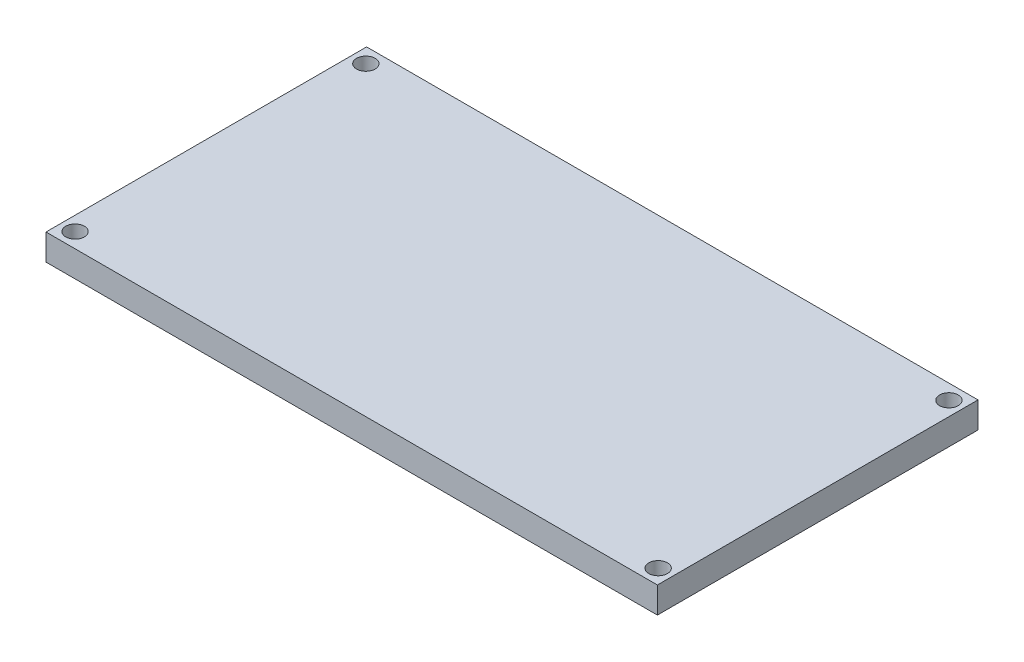
ISO-10303-21;
HEADER;
FILE_DESCRIPTION(('STEP AP214'),'2;1');
FILE_NAME('part.step','',(''),(''),'','','');
FILE_SCHEMA(('AUTOMOTIVE_DESIGN { 1 0 10303 214 1 1 1 1 }'));
ENDSEC;
DATA;
#1=APPLICATION_CONTEXT('core data for automotive mechanical design processes');
#2=APPLICATION_PROTOCOL_DEFINITION('international standard','automotive_design',2000,#1);
#3=PRODUCT_CONTEXT('',#1,'mechanical');
#4=PRODUCT('Part','Part','',(#3));
#5=PRODUCT_RELATED_PRODUCT_CATEGORY('part','',(#4));
#6=PRODUCT_DEFINITION_FORMATION('','',#4);
#7=PRODUCT_DEFINITION_CONTEXT('part definition',#1,'design');
#8=PRODUCT_DEFINITION('design','',#6,#7);
#9=PRODUCT_DEFINITION_SHAPE('','',#8);
#10=(LENGTH_UNIT() NAMED_UNIT(*) SI_UNIT(.MILLI.,.METRE.));
#11=(NAMED_UNIT(*) PLANE_ANGLE_UNIT() SI_UNIT($,.RADIAN.));
#12=(NAMED_UNIT(*) SI_UNIT($,.STERADIAN.) SOLID_ANGLE_UNIT());
#13=UNCERTAINTY_MEASURE_WITH_UNIT(LENGTH_MEASURE(1.E-05),#10,'distance_accuracy_value','');
#14=(GEOMETRIC_REPRESENTATION_CONTEXT(3) GLOBAL_UNCERTAINTY_ASSIGNED_CONTEXT((#13)) GLOBAL_UNIT_ASSIGNED_CONTEXT((#10,
#11,#12)) REPRESENTATION_CONTEXT('',''));
#15=CARTESIAN_POINT('',(0.,0.,0.));
#16=DIRECTION('',(0.,0.,1.));
#17=DIRECTION('',(1.,0.,0.));
#18=AXIS2_PLACEMENT_3D('',#15,#16,#17);
#19=CARTESIAN_POINT('',(52.07,4.445,27.305));
#20=DIRECTION('',(-1.,0.,0.));
#21=DIRECTION('',(0.,0.,1.));
#22=AXIS2_PLACEMENT_3D('',#19,#20,#21);
#23=PLANE('',#22);
#24=DIRECTION('',(0.,0.,-1.));
#25=VECTOR('',#24,1.);
#26=CARTESIAN_POINT('',(52.07,0.,27.305));
#27=LINE('',#26,#25);
#28=CARTESIAN_POINT('',(52.07,0.,27.305));
#29=VERTEX_POINT('',#28);
#30=CARTESIAN_POINT('',(52.07,0.,-27.305));
#31=VERTEX_POINT('',#30);
#32=EDGE_CURVE('E113',#29,#31,#27,.T.);
#33=ORIENTED_EDGE('',*,*,#32,.T.);
#34=DIRECTION('',(0.,-1.,0.));
#35=VECTOR('',#34,1.);
#36=CARTESIAN_POINT('',(52.07,4.445,-27.305));
#37=LINE('',#36,#35);
#38=CARTESIAN_POINT('',(52.07,4.445,-27.305));
#39=VERTEX_POINT('',#38);
#40=EDGE_CURVE('E11',#39,#31,#37,.T.);
#41=ORIENTED_EDGE('',*,*,#40,.F.);
#42=DIRECTION('',(0.,0.,-1.));
#43=VECTOR('',#42,1.);
#44=CARTESIAN_POINT('',(52.07,4.445,27.305));
#45=LINE('',#44,#43);
#46=CARTESIAN_POINT('',(52.07,4.445,27.305));
#47=VERTEX_POINT('',#46);
#48=EDGE_CURVE('E97',#47,#39,#45,.T.);
#49=ORIENTED_EDGE('',*,*,#48,.F.);
#50=DIRECTION('',(0.,-1.,0.));
#51=VECTOR('',#50,1.);
#52=CARTESIAN_POINT('',(52.07,4.445,27.305));
#53=LINE('',#52,#51);
#54=EDGE_CURVE('E109',#47,#29,#53,.T.);
#55=ORIENTED_EDGE('',*,*,#54,.T.);
#56=EDGE_LOOP('',(#33,#41,#49,#55));
#57=FACE_BOUND('',#56,.T.);
#58=ADVANCED_FACE('F45',(#57),#23,.F.);
#59=CARTESIAN_POINT('',(-52.07,4.445,-27.305));
#60=DIRECTION('',(0.,0.,1.));
#61=DIRECTION('',(1.,0.,0.));
#62=AXIS2_PLACEMENT_3D('',#59,#60,#61);
#63=PLANE('',#62);
#64=DIRECTION('',(-1.,0.,0.));
#65=VECTOR('',#64,1.);
#66=CARTESIAN_POINT('',(-52.07,0.,-27.305));
#67=LINE('',#66,#65);
#68=CARTESIAN_POINT('',(-52.07,0.,-27.305));
#69=VERTEX_POINT('',#68);
#70=EDGE_CURVE('E102',#31,#69,#67,.T.);
#71=ORIENTED_EDGE('',*,*,#70,.T.);
#72=DIRECTION('',(0.,-1.,0.));
#73=VECTOR('',#72,1.);
#74=CARTESIAN_POINT('',(-52.07,4.445,-27.305));
#75=LINE('',#74,#73);
#76=CARTESIAN_POINT('',(-52.07,4.445,-27.305));
#77=VERTEX_POINT('',#76);
#78=EDGE_CURVE('E54',#77,#69,#75,.T.);
#79=ORIENTED_EDGE('',*,*,#78,.F.);
#80=DIRECTION('',(-1.,0.,0.));
#81=VECTOR('',#80,1.);
#82=CARTESIAN_POINT('',(-52.07,4.445,-27.305));
#83=LINE('',#82,#81);
#84=EDGE_CURVE('E92',#39,#77,#83,.T.);
#85=ORIENTED_EDGE('',*,*,#84,.F.);
#86=ORIENTED_EDGE('',*,*,#40,.T.);
#87=EDGE_LOOP('',(#71,#79,#85,#86));
#88=FACE_BOUND('',#87,.T.);
#89=ADVANCED_FACE('F101',(#88),#63,.F.);
#90=CARTESIAN_POINT('',(-52.07,4.445,27.305));
#91=DIRECTION('',(1.,0.,0.));
#92=DIRECTION('',(0.,0.,-1.));
#93=AXIS2_PLACEMENT_3D('',#90,#91,#92);
#94=PLANE('',#93);
#95=DIRECTION('',(0.,0.,1.));
#96=VECTOR('',#95,1.);
#97=CARTESIAN_POINT('',(-52.07,0.,27.305));
#98=LINE('',#97,#96);
#99=CARTESIAN_POINT('',(-52.07,0.,27.305));
#100=VERTEX_POINT('',#99);
#101=EDGE_CURVE('E79',#69,#100,#98,.T.);
#102=ORIENTED_EDGE('',*,*,#101,.T.);
#103=DIRECTION('',(0.,-1.,0.));
#104=VECTOR('',#103,1.);
#105=CARTESIAN_POINT('',(-52.07,4.445,27.305));
#106=LINE('',#105,#104);
#107=CARTESIAN_POINT('',(-52.07,4.445,27.305));
#108=VERTEX_POINT('',#107);
#109=EDGE_CURVE('E104',#108,#100,#106,.T.);
#110=ORIENTED_EDGE('',*,*,#109,.F.);
#111=DIRECTION('',(0.,0.,1.));
#112=VECTOR('',#111,1.);
#113=CARTESIAN_POINT('',(-52.07,4.445,27.305));
#114=LINE('',#113,#112);
#115=EDGE_CURVE('E95',#77,#108,#114,.T.);
#116=ORIENTED_EDGE('',*,*,#115,.F.);
#117=ORIENTED_EDGE('',*,*,#78,.T.);
#118=EDGE_LOOP('',(#102,#110,#116,#117));
#119=FACE_BOUND('',#118,.T.);
#120=ADVANCED_FACE('F105',(#119),#94,.F.);
#121=CARTESIAN_POINT('',(-52.07,4.445,27.305));
#122=DIRECTION('',(0.,0.,-1.));
#123=DIRECTION('',(-1.,0.,0.));
#124=AXIS2_PLACEMENT_3D('',#121,#122,#123);
#125=PLANE('',#124);
#126=DIRECTION('',(1.,0.,0.));
#127=VECTOR('',#126,1.);
#128=CARTESIAN_POINT('',(-52.07,0.,27.305));
#129=LINE('',#128,#127);
#130=EDGE_CURVE('E85',#100,#29,#129,.T.);
#131=ORIENTED_EDGE('',*,*,#130,.T.);
#132=ORIENTED_EDGE('',*,*,#54,.F.);
#133=DIRECTION('',(1.,0.,0.));
#134=VECTOR('',#133,1.);
#135=CARTESIAN_POINT('',(-52.07,4.445,27.305));
#136=LINE('',#135,#134);
#137=EDGE_CURVE('E62',#108,#47,#136,.T.);
#138=ORIENTED_EDGE('',*,*,#137,.F.);
#139=ORIENTED_EDGE('',*,*,#109,.T.);
#140=EDGE_LOOP('',(#131,#132,#138,#139));
#141=FACE_BOUND('',#140,.T.);
#142=ADVANCED_FACE('F127',(#141),#125,.F.);
#143=CARTESIAN_POINT('',(0.,4.445,0.));
#144=DIRECTION('',(0.,-1.,0.));
#145=DIRECTION('',(0.,0.,-1.));
#146=AXIS2_PLACEMENT_3D('',#143,#144,#145);
#147=PLANE('',#146);
#148=CARTESIAN_POINT('',(-49.657,4.445,-24.765));
#149=DIRECTION('',(0.,-1.,0.));
#150=DIRECTION('',(0.,0.,-1.));
#151=AXIS2_PLACEMENT_3D('',#148,#149,#150);
#152=CIRCLE('',#151,1.5875);
#153=CARTESIAN_POINT('',(-49.657,4.445,-26.3525));
#154=VERTEX_POINT('',#153);
#155=EDGE_CURVE('E117',#154,#154,#152,.T.);
#156=ORIENTED_EDGE('',*,*,#155,.T.);
#157=EDGE_LOOP('',(#156));
#158=FACE_BOUND('',#157,.T.);
#159=CARTESIAN_POINT('',(49.657,4.445,24.765));
#160=DIRECTION('',(0.,-1.,0.));
#161=DIRECTION('',(0.,0.,-1.));
#162=AXIS2_PLACEMENT_3D('',#159,#160,#161);
#163=CIRCLE('',#162,1.5875);
#164=CARTESIAN_POINT('',(49.657,4.445,23.1775));
#165=VERTEX_POINT('',#164);
#166=EDGE_CURVE('E137',#165,#165,#163,.T.);
#167=ORIENTED_EDGE('',*,*,#166,.T.);
#168=EDGE_LOOP('',(#167));
#169=FACE_BOUND('',#168,.T.);
#170=CARTESIAN_POINT('',(49.657,4.445,-24.765));
#171=DIRECTION('',(0.,-1.,0.));
#172=DIRECTION('',(0.,0.,-1.));
#173=AXIS2_PLACEMENT_3D('',#170,#171,#172);
#174=CIRCLE('',#173,1.5875);
#175=CARTESIAN_POINT('',(49.657,4.445,-26.3525));
#176=VERTEX_POINT('',#175);
#177=EDGE_CURVE('E141',#176,#176,#174,.T.);
#178=ORIENTED_EDGE('',*,*,#177,.T.);
#179=EDGE_LOOP('',(#178));
#180=FACE_BOUND('',#179,.T.);
#181=CARTESIAN_POINT('',(-49.657,4.445,24.765));
#182=DIRECTION('',(0.,-1.,0.));
#183=DIRECTION('',(0.,0.,-1.));
#184=AXIS2_PLACEMENT_3D('',#181,#182,#183);
#185=CIRCLE('',#184,1.5875);
#186=CARTESIAN_POINT('',(-49.657,4.445,23.1775));
#187=VERTEX_POINT('',#186);
#188=EDGE_CURVE('E145',#187,#187,#185,.T.);
#189=ORIENTED_EDGE('',*,*,#188,.T.);
#190=EDGE_LOOP('',(#189));
#191=FACE_BOUND('',#190,.T.);
#192=ORIENTED_EDGE('',*,*,#48,.T.);
#193=ORIENTED_EDGE('',*,*,#84,.T.);
#194=ORIENTED_EDGE('',*,*,#115,.T.);
#195=ORIENTED_EDGE('',*,*,#137,.T.);
#196=EDGE_LOOP('',(#192,#193,#194,#195));
#197=FACE_BOUND('',#196,.T.);
#198=ADVANCED_FACE('F93',(#158,#169,#180,#191,#197),#147,.F.);
#199=CARTESIAN_POINT('',(0.,0.,0.));
#200=DIRECTION('',(0.,-1.,0.));
#201=DIRECTION('',(0.,0.,-1.));
#202=AXIS2_PLACEMENT_3D('',#199,#200,#201);
#203=PLANE('',#202);
#204=CARTESIAN_POINT('',(-49.657,0.,-24.765));
#205=DIRECTION('',(0.,1.,0.));
#206=DIRECTION('',(0.,0.,1.));
#207=AXIS2_PLACEMENT_3D('',#204,#205,#206);
#208=CIRCLE('',#207,1.5875);
#209=CARTESIAN_POINT('',(-49.657,0.,-23.1775));
#210=VERTEX_POINT('',#209);
#211=EDGE_CURVE('E153',#210,#210,#208,.T.);
#212=ORIENTED_EDGE('',*,*,#211,.T.);
#213=EDGE_LOOP('',(#212));
#214=FACE_BOUND('',#213,.T.);
#215=CARTESIAN_POINT('',(49.657,0.,24.765));
#216=DIRECTION('',(0.,1.,0.));
#217=DIRECTION('',(0.,0.,1.));
#218=AXIS2_PLACEMENT_3D('',#215,#216,#217);
#219=CIRCLE('',#218,1.5875);
#220=CARTESIAN_POINT('',(49.657,0.,26.3525));
#221=VERTEX_POINT('',#220);
#222=EDGE_CURVE('E154',#221,#221,#219,.T.);
#223=ORIENTED_EDGE('',*,*,#222,.T.);
#224=EDGE_LOOP('',(#223));
#225=FACE_BOUND('',#224,.T.);
#226=CARTESIAN_POINT('',(49.657,0.,-24.765));
#227=DIRECTION('',(0.,1.,0.));
#228=DIRECTION('',(0.,0.,1.));
#229=AXIS2_PLACEMENT_3D('',#226,#227,#228);
#230=CIRCLE('',#229,1.5875);
#231=CARTESIAN_POINT('',(49.657,0.,-23.1775));
#232=VERTEX_POINT('',#231);
#233=EDGE_CURVE('E158',#232,#232,#230,.T.);
#234=ORIENTED_EDGE('',*,*,#233,.T.);
#235=EDGE_LOOP('',(#234));
#236=FACE_BOUND('',#235,.T.);
#237=CARTESIAN_POINT('',(-49.657,0.,24.765));
#238=DIRECTION('',(0.,1.,0.));
#239=DIRECTION('',(0.,0.,1.));
#240=AXIS2_PLACEMENT_3D('',#237,#238,#239);
#241=CIRCLE('',#240,1.5875);
#242=CARTESIAN_POINT('',(-49.657,0.,26.3525));
#243=VERTEX_POINT('',#242);
#244=EDGE_CURVE('E149',#243,#243,#241,.T.);
#245=ORIENTED_EDGE('',*,*,#244,.T.);
#246=EDGE_LOOP('',(#245));
#247=FACE_BOUND('',#246,.T.);
#248=ORIENTED_EDGE('',*,*,#32,.F.);
#249=ORIENTED_EDGE('',*,*,#130,.F.);
#250=ORIENTED_EDGE('',*,*,#101,.F.);
#251=ORIENTED_EDGE('',*,*,#70,.F.);
#252=EDGE_LOOP('',(#248,#249,#250,#251));
#253=FACE_BOUND('',#252,.T.);
#254=ADVANCED_FACE('F130',(#214,#225,#236,#247,#253),#203,.T.);
#255=CARTESIAN_POINT('',(-49.657,0.,24.765));
#256=DIRECTION('',(0.,1.,0.));
#257=DIRECTION('',(0.,0.,1.));
#258=AXIS2_PLACEMENT_3D('',#255,#256,#257);
#259=CYLINDRICAL_SURFACE('',#258,1.5875);
#260=ORIENTED_EDGE('',*,*,#244,.F.);
#261=EDGE_LOOP('',(#260));
#262=FACE_BOUND('',#261,.T.);
#263=ORIENTED_EDGE('',*,*,#188,.F.);
#264=EDGE_LOOP('',(#263));
#265=FACE_BOUND('',#264,.T.);
#266=ADVANCED_FACE('F172',(#262,#265),#259,.F.);
#267=CARTESIAN_POINT('',(49.657,0.,-24.765));
#268=DIRECTION('',(0.,1.,0.));
#269=DIRECTION('',(0.,0.,1.));
#270=AXIS2_PLACEMENT_3D('',#267,#268,#269);
#271=CYLINDRICAL_SURFACE('',#270,1.5875);
#272=ORIENTED_EDGE('',*,*,#233,.F.);
#273=EDGE_LOOP('',(#272));
#274=FACE_BOUND('',#273,.T.);
#275=ORIENTED_EDGE('',*,*,#177,.F.);
#276=EDGE_LOOP('',(#275));
#277=FACE_BOUND('',#276,.T.);
#278=ADVANCED_FACE('F168',(#274,#277),#271,.F.);
#279=CARTESIAN_POINT('',(49.657,0.,24.765));
#280=DIRECTION('',(0.,1.,0.));
#281=DIRECTION('',(0.,0.,1.));
#282=AXIS2_PLACEMENT_3D('',#279,#280,#281);
#283=CYLINDRICAL_SURFACE('',#282,1.5875);
#284=ORIENTED_EDGE('',*,*,#222,.F.);
#285=EDGE_LOOP('',(#284));
#286=FACE_BOUND('',#285,.T.);
#287=ORIENTED_EDGE('',*,*,#166,.F.);
#288=EDGE_LOOP('',(#287));
#289=FACE_BOUND('',#288,.T.);
#290=ADVANCED_FACE('F171',(#286,#289),#283,.F.);
#291=CARTESIAN_POINT('',(-49.657,0.,-24.765));
#292=DIRECTION('',(0.,1.,0.));
#293=DIRECTION('',(0.,0.,1.));
#294=AXIS2_PLACEMENT_3D('',#291,#292,#293);
#295=CYLINDRICAL_SURFACE('',#294,1.5875);
#296=ORIENTED_EDGE('',*,*,#211,.F.);
#297=EDGE_LOOP('',(#296));
#298=FACE_BOUND('',#297,.T.);
#299=ORIENTED_EDGE('',*,*,#155,.F.);
#300=EDGE_LOOP('',(#299));
#301=FACE_BOUND('',#300,.T.);
#302=ADVANCED_FACE('F236',(#298,#301),#295,.F.);
#303=CLOSED_SHELL('',(#58,#89,#120,#142,#198,#254,#266,#278,#290,#302));
#304=MANIFOLD_SOLID_BREP('B2',#303);
#305=ADVANCED_BREP_SHAPE_REPRESENTATION('',(#18,#304),#14);
#306=SHAPE_DEFINITION_REPRESENTATION(#9,#305);
ENDSEC;
END-ISO-10303-21;
